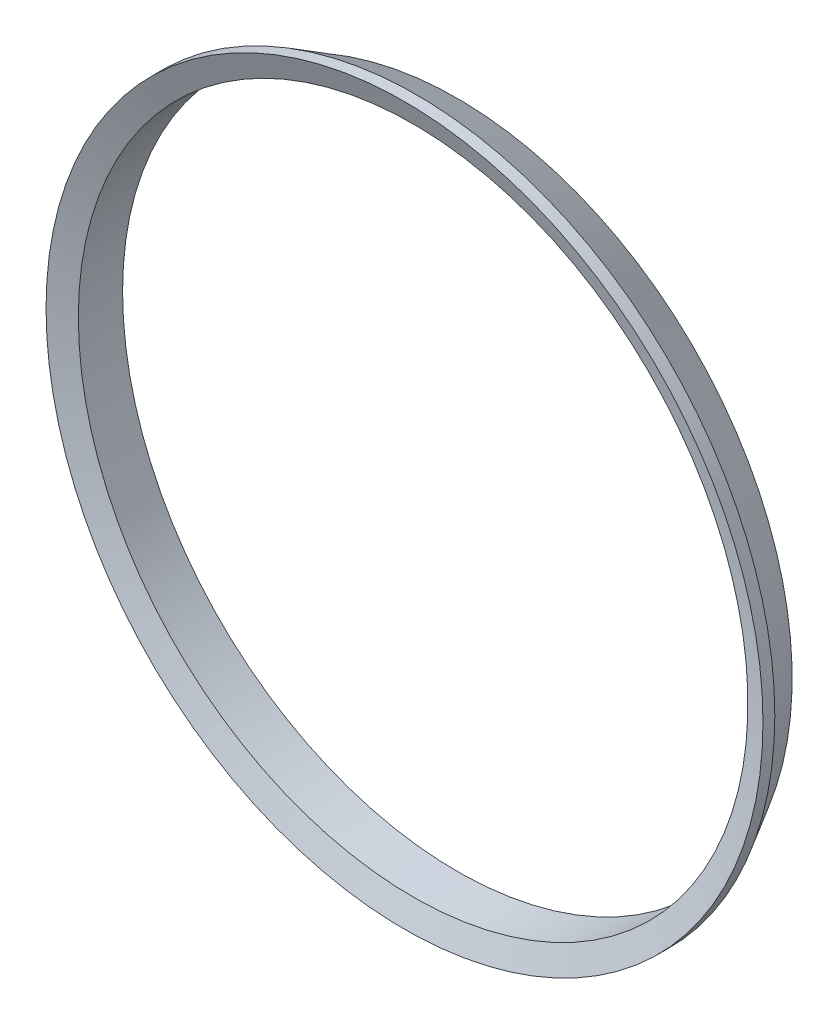
ISO-10303-21;
HEADER;
FILE_DESCRIPTION(('STEP AP214'),'2;1');
FILE_NAME('part.step','',(''),(''),'','','');
FILE_SCHEMA(('AUTOMOTIVE_DESIGN { 1 0 10303 214 1 1 1 1 }'));
ENDSEC;
DATA;
#1=APPLICATION_CONTEXT('core data for automotive mechanical design processes');
#2=APPLICATION_PROTOCOL_DEFINITION('international standard','automotive_design',2000,#1);
#3=PRODUCT_CONTEXT('',#1,'mechanical');
#4=PRODUCT('Part','Part','',(#3));
#5=PRODUCT_RELATED_PRODUCT_CATEGORY('part','',(#4));
#6=PRODUCT_DEFINITION_FORMATION('','',#4);
#7=PRODUCT_DEFINITION_CONTEXT('part definition',#1,'design');
#8=PRODUCT_DEFINITION('design','',#6,#7);
#9=PRODUCT_DEFINITION_SHAPE('','',#8);
#10=(LENGTH_UNIT() NAMED_UNIT(*) SI_UNIT(.MILLI.,.METRE.));
#11=(NAMED_UNIT(*) PLANE_ANGLE_UNIT() SI_UNIT($,.RADIAN.));
#12=(NAMED_UNIT(*) SI_UNIT($,.STERADIAN.) SOLID_ANGLE_UNIT());
#13=UNCERTAINTY_MEASURE_WITH_UNIT(LENGTH_MEASURE(1.E-05),#10,'distance_accuracy_value','');
#14=(GEOMETRIC_REPRESENTATION_CONTEXT(3) GLOBAL_UNCERTAINTY_ASSIGNED_CONTEXT((#13)) GLOBAL_UNIT_ASSIGNED_CONTEXT((#10,
#11,#12)) REPRESENTATION_CONTEXT('',''));
#15=CARTESIAN_POINT('',(0.,0.,0.));
#16=DIRECTION('',(0.,0.,1.));
#17=DIRECTION('',(1.,0.,0.));
#18=AXIS2_PLACEMENT_3D('',#15,#16,#17);
#19=CARTESIAN_POINT('',(0.,0.,0.));
#20=DIRECTION('',(0.,0.,-1.));
#21=DIRECTION('',(-1.,0.,0.));
#22=AXIS2_PLACEMENT_3D('',#19,#20,#21);
#23=CYLINDRICAL_SURFACE('',#22,141.4);
#24=CARTESIAN_POINT('',(0.,0.,1.36029765733793));
#25=DIRECTION('',(0.,0.,-1.));
#26=DIRECTION('',(-1.,0.,0.));
#27=AXIS2_PLACEMENT_3D('',#24,#25,#26);
#28=CIRCLE('',#27,141.4);
#29=CARTESIAN_POINT('',(-141.4,0.,1.36029765733793));
#30=VERTEX_POINT('',#29);
#31=EDGE_CURVE('E10',#30,#30,#28,.T.);
#32=ORIENTED_EDGE('',*,*,#31,.F.);
#33=EDGE_LOOP('',(#32));
#34=FACE_BOUND('',#33,.T.);
#35=CARTESIAN_POINT('',(0.,0.,-17.320508075689));
#36=DIRECTION('',(0.,0.,-1.));
#37=DIRECTION('',(-1.,0.,0.));
#38=AXIS2_PLACEMENT_3D('',#35,#36,#37);
#39=CIRCLE('',#38,141.4);
#40=CARTESIAN_POINT('',(-141.4,0.,-17.320508075689));
#41=VERTEX_POINT('',#40);
#42=EDGE_CURVE('E51',#41,#41,#39,.T.);
#43=ORIENTED_EDGE('',*,*,#42,.T.);
#44=EDGE_LOOP('',(#43));
#45=FACE_BOUND('',#44,.T.);
#46=ADVANCED_FACE('F40',(#34,#45),#23,.F.);
#47=CARTESIAN_POINT('',(0.,0.,1.36029765733793));
#48=DIRECTION('',(0.,0.,1.));
#49=DIRECTION('',(1.,0.,0.));
#50=AXIS2_PLACEMENT_3D('',#47,#48,#49);
#51=CONICAL_SURFACE('',#50,141.4,1.22173047639603);
#52=CARTESIAN_POINT('',(0.,0.,5.));
#53=DIRECTION('',(0.,0.,-1.));
#54=DIRECTION('',(-1.,0.,0.));
#55=AXIS2_PLACEMENT_3D('',#52,#53,#54);
#56=CIRCLE('',#55,151.4);
#57=CARTESIAN_POINT('',(-151.4,0.,5.));
#58=VERTEX_POINT('',#57);
#59=EDGE_CURVE('E43',#58,#58,#56,.T.);
#60=ORIENTED_EDGE('',*,*,#59,.F.);
#61=EDGE_LOOP('',(#60));
#62=FACE_BOUND('',#61,.T.);
#63=ORIENTED_EDGE('',*,*,#31,.T.);
#64=EDGE_LOOP('',(#63));
#65=FACE_BOUND('',#64,.T.);
#66=ADVANCED_FACE('F67',(#62,#65),#51,.F.);
#67=CARTESIAN_POINT('',(0.,0.,0.));
#68=DIRECTION('',(0.,0.,-1.));
#69=DIRECTION('',(-1.,0.,0.));
#70=AXIS2_PLACEMENT_3D('',#67,#68,#69);
#71=CYLINDRICAL_SURFACE('',#70,151.4);
#72=CARTESIAN_POINT('',(0.,0.,0.));
#73=DIRECTION('',(0.,0.,-1.));
#74=DIRECTION('',(-1.,0.,0.));
#75=AXIS2_PLACEMENT_3D('',#72,#73,#74);
#76=CIRCLE('',#75,151.4);
#77=CARTESIAN_POINT('',(-151.4,0.,0.));
#78=VERTEX_POINT('',#77);
#79=EDGE_CURVE('E50',#78,#78,#76,.T.);
#80=ORIENTED_EDGE('',*,*,#79,.F.);
#81=EDGE_LOOP('',(#80));
#82=FACE_BOUND('',#81,.T.);
#83=ORIENTED_EDGE('',*,*,#59,.T.);
#84=EDGE_LOOP('',(#83));
#85=FACE_BOUND('',#84,.T.);
#86=ADVANCED_FACE('F62',(#82,#85),#71,.T.);
#87=CARTESIAN_POINT('',(0.,0.,0.));
#88=DIRECTION('',(0.,0.,1.));
#89=DIRECTION('',(1.,0.,0.));
#90=AXIS2_PLACEMENT_3D('',#87,#88,#89);
#91=CONICAL_SURFACE('',#90,151.4,0.523598775598293);
#92=ORIENTED_EDGE('',*,*,#42,.F.);
#93=EDGE_LOOP('',(#92));
#94=FACE_BOUND('',#93,.T.);
#95=ORIENTED_EDGE('',*,*,#79,.T.);
#96=EDGE_LOOP('',(#95));
#97=FACE_BOUND('',#96,.T.);
#98=ADVANCED_FACE('F59',(#94,#97),#91,.T.);
#99=CLOSED_SHELL('',(#46,#66,#86,#98));
#100=MANIFOLD_SOLID_BREP('B2',#99);
#101=ADVANCED_BREP_SHAPE_REPRESENTATION('',(#18,#100),#14);
#102=SHAPE_DEFINITION_REPRESENTATION(#9,#101);
ENDSEC;
END-ISO-10303-21;
